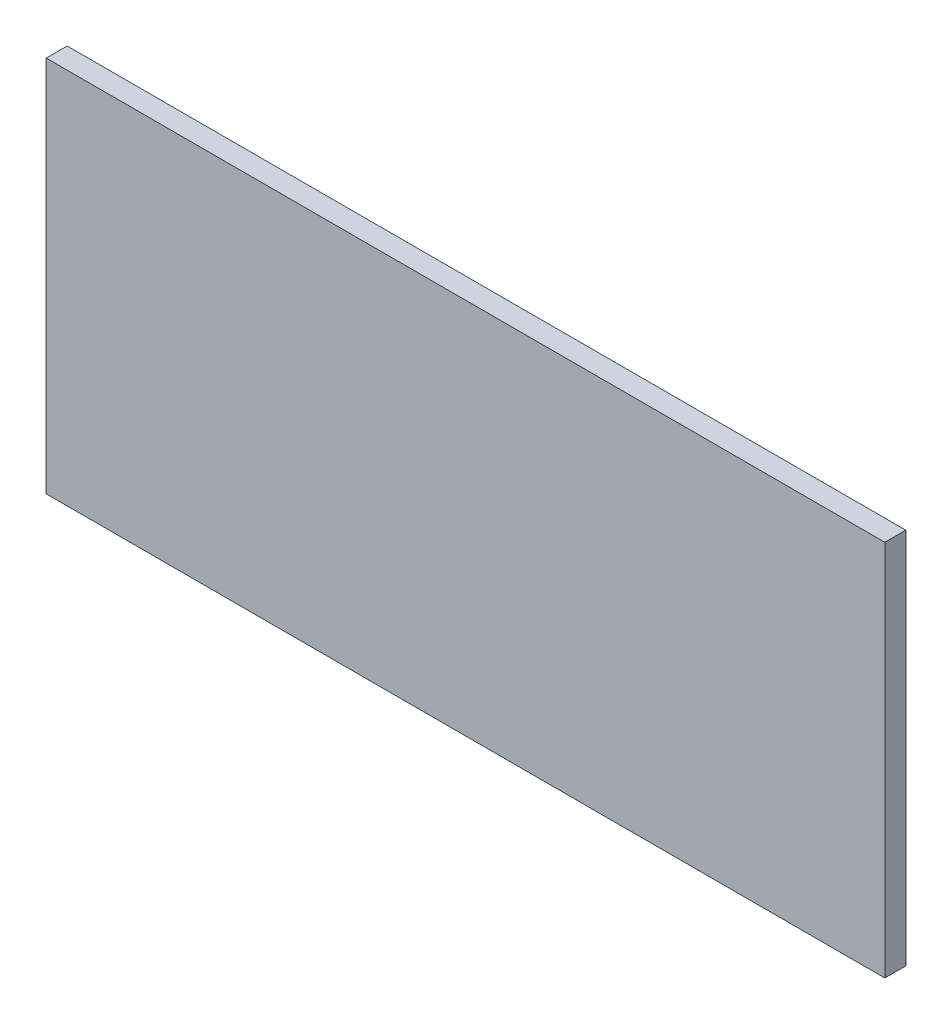
ISO-10303-21;
HEADER;
FILE_DESCRIPTION(('STEP AP214'),'2;1');
FILE_NAME('part.step','',(''),(''),'','','');
FILE_SCHEMA(('AUTOMOTIVE_DESIGN { 1 0 10303 214 1 1 1 1 }'));
ENDSEC;
DATA;
#1=APPLICATION_CONTEXT('core data for automotive mechanical design processes');
#2=APPLICATION_PROTOCOL_DEFINITION('international standard','automotive_design',2000,#1);
#3=PRODUCT_CONTEXT('',#1,'mechanical');
#4=PRODUCT('Part','Part','',(#3));
#5=PRODUCT_RELATED_PRODUCT_CATEGORY('part','',(#4));
#6=PRODUCT_DEFINITION_FORMATION('','',#4);
#7=PRODUCT_DEFINITION_CONTEXT('part definition',#1,'design');
#8=PRODUCT_DEFINITION('design','',#6,#7);
#9=PRODUCT_DEFINITION_SHAPE('','',#8);
#10=(LENGTH_UNIT() NAMED_UNIT(*) SI_UNIT(.MILLI.,.METRE.));
#11=(NAMED_UNIT(*) PLANE_ANGLE_UNIT() SI_UNIT($,.RADIAN.));
#12=(NAMED_UNIT(*) SI_UNIT($,.STERADIAN.) SOLID_ANGLE_UNIT());
#13=UNCERTAINTY_MEASURE_WITH_UNIT(LENGTH_MEASURE(1.E-05),#10,'distance_accuracy_value','');
#14=(GEOMETRIC_REPRESENTATION_CONTEXT(3) GLOBAL_UNCERTAINTY_ASSIGNED_CONTEXT((#13)) GLOBAL_UNIT_ASSIGNED_CONTEXT((#10,
#11,#12)) REPRESENTATION_CONTEXT('',''));
#15=CARTESIAN_POINT('',(0.,0.,0.));
#16=DIRECTION('',(0.,0.,1.));
#17=DIRECTION('',(1.,0.,0.));
#18=AXIS2_PLACEMENT_3D('',#15,#16,#17);
#19=CARTESIAN_POINT('',(0.,0.,10.));
#20=DIRECTION('',(-1.,0.,0.));
#21=DIRECTION('',(0.,-1.,0.));
#22=AXIS2_PLACEMENT_3D('',#19,#20,#21);
#23=PLANE('',#22);
#24=DIRECTION('',(0.,1.,0.));
#25=VECTOR('',#24,1.);
#26=CARTESIAN_POINT('',(0.,0.,0.));
#27=LINE('',#26,#25);
#28=CARTESIAN_POINT('',(0.,0.,0.));
#29=VERTEX_POINT('',#28);
#30=CARTESIAN_POINT('',(0.,180.,0.));
#31=VERTEX_POINT('',#30);
#32=EDGE_CURVE('E95',#29,#31,#27,.T.);
#33=ORIENTED_EDGE('',*,*,#32,.T.);
#34=DIRECTION('',(0.,0.,-1.));
#35=VECTOR('',#34,1.);
#36=CARTESIAN_POINT('',(0.,180.,10.));
#37=LINE('',#36,#35);
#38=CARTESIAN_POINT('',(0.,180.,10.));
#39=VERTEX_POINT('',#38);
#40=EDGE_CURVE('E11',#39,#31,#37,.T.);
#41=ORIENTED_EDGE('',*,*,#40,.F.);
#42=DIRECTION('',(0.,1.,0.));
#43=VECTOR('',#42,1.);
#44=CARTESIAN_POINT('',(0.,0.,10.));
#45=LINE('',#44,#43);
#46=CARTESIAN_POINT('',(0.,0.,10.));
#47=VERTEX_POINT('',#46);
#48=EDGE_CURVE('E83',#47,#39,#45,.T.);
#49=ORIENTED_EDGE('',*,*,#48,.F.);
#50=DIRECTION('',(0.,0.,-1.));
#51=VECTOR('',#50,1.);
#52=CARTESIAN_POINT('',(0.,0.,10.));
#53=LINE('',#52,#51);
#54=EDGE_CURVE('E91',#47,#29,#53,.T.);
#55=ORIENTED_EDGE('',*,*,#54,.T.);
#56=EDGE_LOOP('',(#33,#41,#49,#55));
#57=FACE_BOUND('',#56,.T.);
#58=ADVANCED_FACE('F32',(#57),#23,.F.);
#59=CARTESIAN_POINT('',(0.,180.,10.));
#60=DIRECTION('',(0.,-1.,0.));
#61=DIRECTION('',(1.,0.,0.));
#62=AXIS2_PLACEMENT_3D('',#59,#60,#61);
#63=PLANE('',#62);
#64=DIRECTION('',(-1.,0.,0.));
#65=VECTOR('',#64,1.);
#66=CARTESIAN_POINT('',(0.,180.,0.));
#67=LINE('',#66,#65);
#68=CARTESIAN_POINT('',(-400.,180.,0.));
#69=VERTEX_POINT('',#68);
#70=EDGE_CURVE('E87',#31,#69,#67,.T.);
#71=ORIENTED_EDGE('',*,*,#70,.T.);
#72=DIRECTION('',(0.,0.,-1.));
#73=VECTOR('',#72,1.);
#74=CARTESIAN_POINT('',(-400.,180.,10.));
#75=LINE('',#74,#73);
#76=CARTESIAN_POINT('',(-400.,180.,10.));
#77=VERTEX_POINT('',#76);
#78=EDGE_CURVE('E40',#77,#69,#75,.T.);
#79=ORIENTED_EDGE('',*,*,#78,.F.);
#80=DIRECTION('',(-1.,0.,0.));
#81=VECTOR('',#80,1.);
#82=CARTESIAN_POINT('',(0.,180.,10.));
#83=LINE('',#82,#81);
#84=EDGE_CURVE('E78',#39,#77,#83,.T.);
#85=ORIENTED_EDGE('',*,*,#84,.F.);
#86=ORIENTED_EDGE('',*,*,#40,.T.);
#87=EDGE_LOOP('',(#71,#79,#85,#86));
#88=FACE_BOUND('',#87,.T.);
#89=ADVANCED_FACE('F86',(#88),#63,.F.);
#90=CARTESIAN_POINT('',(-400.,0.,10.));
#91=DIRECTION('',(1.,0.,0.));
#92=DIRECTION('',(0.,0.,-1.));
#93=AXIS2_PLACEMENT_3D('',#90,#91,#92);
#94=PLANE('',#93);
#95=DIRECTION('',(0.,-1.,0.));
#96=VECTOR('',#95,1.);
#97=CARTESIAN_POINT('',(-400.,0.,0.));
#98=LINE('',#97,#96);
#99=CARTESIAN_POINT('',(-400.,0.,0.));
#100=VERTEX_POINT('',#99);
#101=EDGE_CURVE('E65',#69,#100,#98,.T.);
#102=ORIENTED_EDGE('',*,*,#101,.T.);
#103=DIRECTION('',(0.,0.,-1.));
#104=VECTOR('',#103,1.);
#105=CARTESIAN_POINT('',(-400.,0.,10.));
#106=LINE('',#105,#104);
#107=CARTESIAN_POINT('',(-400.,0.,10.));
#108=VERTEX_POINT('',#107);
#109=EDGE_CURVE('E88',#108,#100,#106,.T.);
#110=ORIENTED_EDGE('',*,*,#109,.F.);
#111=DIRECTION('',(0.,-1.,0.));
#112=VECTOR('',#111,1.);
#113=CARTESIAN_POINT('',(-400.,0.,10.));
#114=LINE('',#113,#112);
#115=EDGE_CURVE('E81',#77,#108,#114,.T.);
#116=ORIENTED_EDGE('',*,*,#115,.F.);
#117=ORIENTED_EDGE('',*,*,#78,.T.);
#118=EDGE_LOOP('',(#102,#110,#116,#117));
#119=FACE_BOUND('',#118,.T.);
#120=ADVANCED_FACE('F89',(#119),#94,.F.);
#121=CARTESIAN_POINT('',(0.,0.,10.));
#122=DIRECTION('',(0.,1.,0.));
#123=DIRECTION('',(0.,0.,1.));
#124=AXIS2_PLACEMENT_3D('',#121,#122,#123);
#125=PLANE('',#124);
#126=DIRECTION('',(1.,0.,0.));
#127=VECTOR('',#126,1.);
#128=CARTESIAN_POINT('',(0.,0.,0.));
#129=LINE('',#128,#127);
#130=EDGE_CURVE('E71',#100,#29,#129,.T.);
#131=ORIENTED_EDGE('',*,*,#130,.T.);
#132=ORIENTED_EDGE('',*,*,#54,.F.);
#133=DIRECTION('',(1.,0.,0.));
#134=VECTOR('',#133,1.);
#135=CARTESIAN_POINT('',(0.,0.,10.));
#136=LINE('',#135,#134);
#137=EDGE_CURVE('E48',#108,#47,#136,.T.);
#138=ORIENTED_EDGE('',*,*,#137,.F.);
#139=ORIENTED_EDGE('',*,*,#109,.T.);
#140=EDGE_LOOP('',(#131,#132,#138,#139));
#141=FACE_BOUND('',#140,.T.);
#142=ADVANCED_FACE('F102',(#141),#125,.F.);
#143=CARTESIAN_POINT('',(0.,0.,10.));
#144=DIRECTION('',(0.,0.,1.));
#145=DIRECTION('',(1.,0.,0.));
#146=AXIS2_PLACEMENT_3D('',#143,#144,#145);
#147=PLANE('',#146);
#148=ORIENTED_EDGE('',*,*,#48,.T.);
#149=ORIENTED_EDGE('',*,*,#84,.T.);
#150=ORIENTED_EDGE('',*,*,#115,.T.);
#151=ORIENTED_EDGE('',*,*,#137,.T.);
#152=EDGE_LOOP('',(#148,#149,#150,#151));
#153=FACE_BOUND('',#152,.T.);
#154=ADVANCED_FACE('F79',(#153),#147,.T.);
#155=CARTESIAN_POINT('',(0.,0.,0.));
#156=DIRECTION('',(0.,0.,1.));
#157=DIRECTION('',(1.,0.,0.));
#158=AXIS2_PLACEMENT_3D('',#155,#156,#157);
#159=PLANE('',#158);
#160=ORIENTED_EDGE('',*,*,#32,.F.);
#161=ORIENTED_EDGE('',*,*,#130,.F.);
#162=ORIENTED_EDGE('',*,*,#101,.F.);
#163=ORIENTED_EDGE('',*,*,#70,.F.);
#164=EDGE_LOOP('',(#160,#161,#162,#163));
#165=FACE_BOUND('',#164,.T.);
#166=ADVANCED_FACE('F105',(#165),#159,.F.);
#167=CLOSED_SHELL('',(#58,#89,#120,#142,#154,#166));
#168=MANIFOLD_SOLID_BREP('B2',#167);
#169=ADVANCED_BREP_SHAPE_REPRESENTATION('',(#18,#168),#14);
#170=SHAPE_DEFINITION_REPRESENTATION(#9,#169);
ENDSEC;
END-ISO-10303-21;
